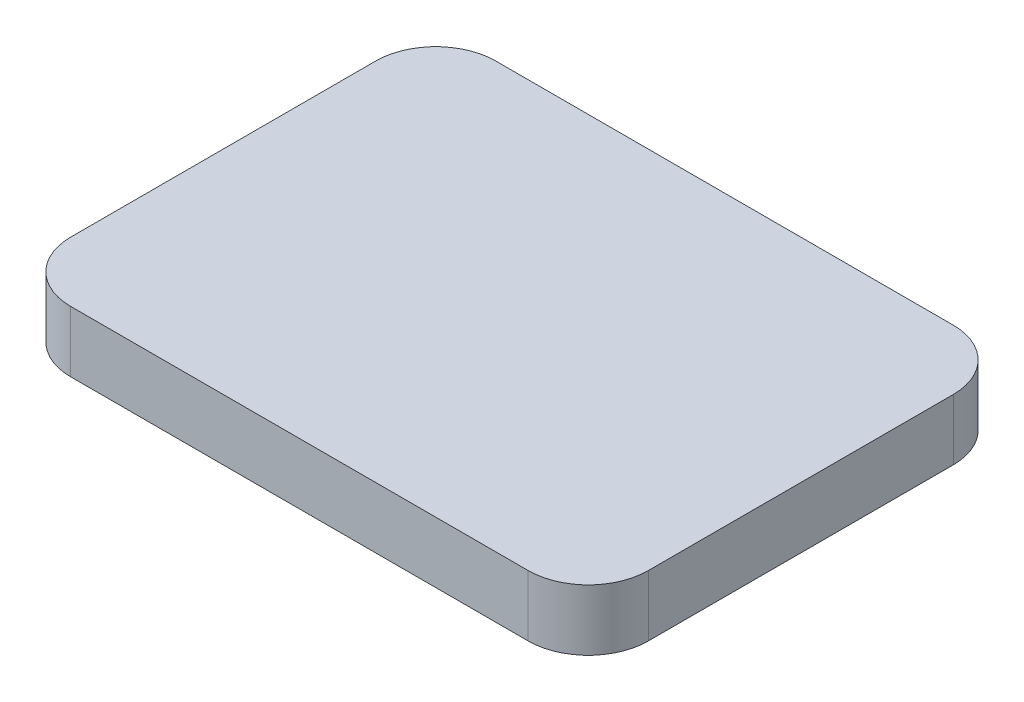
ISO-10303-21;
HEADER;
FILE_DESCRIPTION(('STEP AP214'),'2;1');
FILE_NAME('part.step','',(''),(''),'','','');
FILE_SCHEMA(('AUTOMOTIVE_DESIGN { 1 0 10303 214 1 1 1 1 }'));
ENDSEC;
DATA;
#1=APPLICATION_CONTEXT('core data for automotive mechanical design processes');
#2=APPLICATION_PROTOCOL_DEFINITION('international standard','automotive_design',2000,#1);
#3=PRODUCT_CONTEXT('',#1,'mechanical');
#4=PRODUCT('Part','Part','',(#3));
#5=PRODUCT_RELATED_PRODUCT_CATEGORY('part','',(#4));
#6=PRODUCT_DEFINITION_FORMATION('','',#4);
#7=PRODUCT_DEFINITION_CONTEXT('part definition',#1,'design');
#8=PRODUCT_DEFINITION('design','',#6,#7);
#9=PRODUCT_DEFINITION_SHAPE('','',#8);
#10=(LENGTH_UNIT() NAMED_UNIT(*) SI_UNIT(.MILLI.,.METRE.));
#11=(NAMED_UNIT(*) PLANE_ANGLE_UNIT() SI_UNIT($,.RADIAN.));
#12=(NAMED_UNIT(*) SI_UNIT($,.STERADIAN.) SOLID_ANGLE_UNIT());
#13=UNCERTAINTY_MEASURE_WITH_UNIT(LENGTH_MEASURE(1.E-05),#10,'distance_accuracy_value','');
#14=(GEOMETRIC_REPRESENTATION_CONTEXT(3) GLOBAL_UNCERTAINTY_ASSIGNED_CONTEXT((#13)) GLOBAL_UNIT_ASSIGNED_CONTEXT((#10,
#11,#12)) REPRESENTATION_CONTEXT('',''));
#15=CARTESIAN_POINT('',(0.,0.,0.));
#16=DIRECTION('',(0.,0.,1.));
#17=DIRECTION('',(1.,0.,0.));
#18=AXIS2_PLACEMENT_3D('',#15,#16,#17);
#19=CARTESIAN_POINT('',(-38.1,10.16,-25.4));
#20=DIRECTION('',(0.,-1.,0.));
#21=DIRECTION('',(0.,0.,-1.));
#22=AXIS2_PLACEMENT_3D('',#19,#20,#21);
#23=CYLINDRICAL_SURFACE('',#22,10.);
#24=CARTESIAN_POINT('',(-38.1,0.,-25.4));
#25=DIRECTION('',(0.,1.,0.));
#26=DIRECTION('',(0.,0.,-1.));
#27=AXIS2_PLACEMENT_3D('',#24,#25,#26);
#28=CIRCLE('',#27,10.);
#29=CARTESIAN_POINT('',(-38.1,0.,-35.4));
#30=VERTEX_POINT('',#29);
#31=CARTESIAN_POINT('',(-48.1,0.,-25.4));
#32=VERTEX_POINT('',#31);
#33=EDGE_CURVE('E135',#30,#32,#28,.T.);
#34=ORIENTED_EDGE('',*,*,#33,.T.);
#35=DIRECTION('',(0.,-1.,0.));
#36=VECTOR('',#35,1.);
#37=CARTESIAN_POINT('',(-48.1,10.16,-25.4));
#38=LINE('',#37,#36);
#39=CARTESIAN_POINT('',(-48.1,10.16,-25.4));
#40=VERTEX_POINT('',#39);
#41=EDGE_CURVE('E11',#40,#32,#38,.T.);
#42=ORIENTED_EDGE('',*,*,#41,.F.);
#43=CARTESIAN_POINT('',(-38.1,10.16,-25.4));
#44=DIRECTION('',(0.,1.,0.));
#45=DIRECTION('',(0.,0.,-1.));
#46=AXIS2_PLACEMENT_3D('',#43,#44,#45);
#47=CIRCLE('',#46,10.);
#48=CARTESIAN_POINT('',(-38.1,10.16,-35.4));
#49=VERTEX_POINT('',#48);
#50=EDGE_CURVE('E149',#49,#40,#47,.T.);
#51=ORIENTED_EDGE('',*,*,#50,.F.);
#52=DIRECTION('',(0.,-1.,0.));
#53=VECTOR('',#52,1.);
#54=CARTESIAN_POINT('',(-38.1,10.16,-35.4));
#55=LINE('',#54,#53);
#56=EDGE_CURVE('E131',#49,#30,#55,.T.);
#57=ORIENTED_EDGE('',*,*,#56,.T.);
#58=EDGE_LOOP('',(#34,#42,#51,#57));
#59=FACE_BOUND('',#58,.T.);
#60=ADVANCED_FACE('F39',(#59),#23,.T.);
#61=CARTESIAN_POINT('',(-48.1,10.16,25.4));
#62=DIRECTION('',(1.,0.,0.));
#63=DIRECTION('',(0.,0.,-1.));
#64=AXIS2_PLACEMENT_3D('',#61,#62,#63);
#65=PLANE('',#64);
#66=DIRECTION('',(0.,0.,1.));
#67=VECTOR('',#66,1.);
#68=CARTESIAN_POINT('',(-48.1,0.,25.4));
#69=LINE('',#68,#67);
#70=CARTESIAN_POINT('',(-48.1,0.,25.4));
#71=VERTEX_POINT('',#70);
#72=EDGE_CURVE('E138',#32,#71,#69,.T.);
#73=ORIENTED_EDGE('',*,*,#72,.T.);
#74=DIRECTION('',(0.,-1.,0.));
#75=VECTOR('',#74,1.);
#76=CARTESIAN_POINT('',(-48.1,10.16,25.4));
#77=LINE('',#76,#75);
#78=CARTESIAN_POINT('',(-48.1,10.16,25.4));
#79=VERTEX_POINT('',#78);
#80=EDGE_CURVE('E47',#79,#71,#77,.T.);
#81=ORIENTED_EDGE('',*,*,#80,.F.);
#82=DIRECTION('',(0.,0.,1.));
#83=VECTOR('',#82,1.);
#84=CARTESIAN_POINT('',(-48.1,10.16,25.4));
#85=LINE('',#84,#83);
#86=EDGE_CURVE('E98',#40,#79,#85,.T.);
#87=ORIENTED_EDGE('',*,*,#86,.F.);
#88=ORIENTED_EDGE('',*,*,#41,.T.);
#89=EDGE_LOOP('',(#73,#81,#87,#88));
#90=FACE_BOUND('',#89,.T.);
#91=ADVANCED_FACE('F184',(#90),#65,.F.);
#92=CARTESIAN_POINT('',(-38.1,10.16,25.4));
#93=DIRECTION('',(0.,-1.,0.));
#94=DIRECTION('',(0.,0.,-1.));
#95=AXIS2_PLACEMENT_3D('',#92,#93,#94);
#96=CYLINDRICAL_SURFACE('',#95,10.);
#97=CARTESIAN_POINT('',(-38.1,0.,25.4));
#98=DIRECTION('',(0.,1.,0.));
#99=DIRECTION('',(0.,0.,-1.));
#100=AXIS2_PLACEMENT_3D('',#97,#98,#99);
#101=CIRCLE('',#100,10.);
#102=CARTESIAN_POINT('',(-38.1,0.,35.4));
#103=VERTEX_POINT('',#102);
#104=EDGE_CURVE('E140',#71,#103,#101,.T.);
#105=ORIENTED_EDGE('',*,*,#104,.T.);
#106=DIRECTION('',(0.,-1.,0.));
#107=VECTOR('',#106,1.);
#108=CARTESIAN_POINT('',(-38.1,10.16,35.4));
#109=LINE('',#108,#107);
#110=CARTESIAN_POINT('',(-38.1,10.16,35.4));
#111=VERTEX_POINT('',#110);
#112=EDGE_CURVE('E156',#111,#103,#109,.T.);
#113=ORIENTED_EDGE('',*,*,#112,.F.);
#114=CARTESIAN_POINT('',(-38.1,10.16,25.4));
#115=DIRECTION('',(0.,1.,0.));
#116=DIRECTION('',(0.,0.,-1.));
#117=AXIS2_PLACEMENT_3D('',#114,#115,#116);
#118=CIRCLE('',#117,10.);
#119=EDGE_CURVE('E164',#79,#111,#118,.T.);
#120=ORIENTED_EDGE('',*,*,#119,.F.);
#121=ORIENTED_EDGE('',*,*,#80,.T.);
#122=EDGE_LOOP('',(#105,#113,#120,#121));
#123=FACE_BOUND('',#122,.T.);
#124=ADVANCED_FACE('F162',(#123),#96,.T.);
#125=CARTESIAN_POINT('',(-38.1,10.16,35.4));
#126=DIRECTION('',(0.,0.,-1.));
#127=DIRECTION('',(-1.,0.,0.));
#128=AXIS2_PLACEMENT_3D('',#125,#126,#127);
#129=PLANE('',#128);
#130=DIRECTION('',(1.,0.,0.));
#131=VECTOR('',#130,1.);
#132=CARTESIAN_POINT('',(-38.1,0.,35.4));
#133=LINE('',#132,#131);
#134=CARTESIAN_POINT('',(38.1,0.,35.4));
#135=VERTEX_POINT('',#134);
#136=EDGE_CURVE('E142',#103,#135,#133,.T.);
#137=ORIENTED_EDGE('',*,*,#136,.T.);
#138=DIRECTION('',(0.,-1.,0.));
#139=VECTOR('',#138,1.);
#140=CARTESIAN_POINT('',(38.1,10.16,35.4));
#141=LINE('',#140,#139);
#142=CARTESIAN_POINT('',(38.1,10.16,35.4));
#143=VERTEX_POINT('',#142);
#144=EDGE_CURVE('E153',#143,#135,#141,.T.);
#145=ORIENTED_EDGE('',*,*,#144,.F.);
#146=DIRECTION('',(1.,0.,0.));
#147=VECTOR('',#146,1.);
#148=CARTESIAN_POINT('',(-38.1,10.16,35.4));
#149=LINE('',#148,#147);
#150=EDGE_CURVE('E176',#111,#143,#149,.T.);
#151=ORIENTED_EDGE('',*,*,#150,.F.);
#152=ORIENTED_EDGE('',*,*,#112,.T.);
#153=EDGE_LOOP('',(#137,#145,#151,#152));
#154=FACE_BOUND('',#153,.T.);
#155=ADVANCED_FACE('F172',(#154),#129,.F.);
#156=CARTESIAN_POINT('',(38.1,10.16,25.4));
#157=DIRECTION('',(0.,-1.,0.));
#158=DIRECTION('',(0.,0.,-1.));
#159=AXIS2_PLACEMENT_3D('',#156,#157,#158);
#160=CYLINDRICAL_SURFACE('',#159,10.);
#161=CARTESIAN_POINT('',(38.1,0.,25.4));
#162=DIRECTION('',(0.,1.,0.));
#163=DIRECTION('',(0.,0.,1.));
#164=AXIS2_PLACEMENT_3D('',#161,#162,#163);
#165=CIRCLE('',#164,10.);
#166=CARTESIAN_POINT('',(48.1,0.,25.4));
#167=VERTEX_POINT('',#166);
#168=EDGE_CURVE('E144',#135,#167,#165,.T.);
#169=ORIENTED_EDGE('',*,*,#168,.T.);
#170=DIRECTION('',(0.,-1.,0.));
#171=VECTOR('',#170,1.);
#172=CARTESIAN_POINT('',(48.1,10.16,25.4));
#173=LINE('',#172,#171);
#174=CARTESIAN_POINT('',(48.1,10.16,25.4));
#175=VERTEX_POINT('',#174);
#176=EDGE_CURVE('E126',#175,#167,#173,.T.);
#177=ORIENTED_EDGE('',*,*,#176,.F.);
#178=CARTESIAN_POINT('',(38.1,10.16,25.4));
#179=DIRECTION('',(0.,1.,0.));
#180=DIRECTION('',(0.,0.,1.));
#181=AXIS2_PLACEMENT_3D('',#178,#179,#180);
#182=CIRCLE('',#181,10.);
#183=EDGE_CURVE('E117',#143,#175,#182,.T.);
#184=ORIENTED_EDGE('',*,*,#183,.F.);
#185=ORIENTED_EDGE('',*,*,#144,.T.);
#186=EDGE_LOOP('',(#169,#177,#184,#185));
#187=FACE_BOUND('',#186,.T.);
#188=ADVANCED_FACE('F175',(#187),#160,.T.);
#189=CARTESIAN_POINT('',(48.1,10.16,25.4));
#190=DIRECTION('',(-1.,0.,0.));
#191=DIRECTION('',(0.,0.,1.));
#192=AXIS2_PLACEMENT_3D('',#189,#190,#191);
#193=PLANE('',#192);
#194=DIRECTION('',(0.,0.,-1.));
#195=VECTOR('',#194,1.);
#196=CARTESIAN_POINT('',(48.1,0.,25.4));
#197=LINE('',#196,#195);
#198=CARTESIAN_POINT('',(48.1,0.,-25.4));
#199=VERTEX_POINT('',#198);
#200=EDGE_CURVE('E125',#167,#199,#197,.T.);
#201=ORIENTED_EDGE('',*,*,#200,.T.);
#202=DIRECTION('',(0.,-1.,0.));
#203=VECTOR('',#202,1.);
#204=CARTESIAN_POINT('',(48.1,10.16,-25.4));
#205=LINE('',#204,#203);
#206=CARTESIAN_POINT('',(48.1,10.16,-25.4));
#207=VERTEX_POINT('',#206);
#208=EDGE_CURVE('E122',#207,#199,#205,.T.);
#209=ORIENTED_EDGE('',*,*,#208,.F.);
#210=DIRECTION('',(0.,0.,-1.));
#211=VECTOR('',#210,1.);
#212=CARTESIAN_POINT('',(48.1,10.16,25.4));
#213=LINE('',#212,#211);
#214=EDGE_CURVE('E111',#175,#207,#213,.T.);
#215=ORIENTED_EDGE('',*,*,#214,.F.);
#216=ORIENTED_EDGE('',*,*,#176,.T.);
#217=EDGE_LOOP('',(#201,#209,#215,#216));
#218=FACE_BOUND('',#217,.T.);
#219=ADVANCED_FACE('F123',(#218),#193,.F.);
#220=CARTESIAN_POINT('',(38.1,10.16,-25.4));
#221=DIRECTION('',(0.,-1.,0.));
#222=DIRECTION('',(0.,0.,-1.));
#223=AXIS2_PLACEMENT_3D('',#220,#221,#222);
#224=CYLINDRICAL_SURFACE('',#223,10.);
#225=CARTESIAN_POINT('',(38.1,0.,-25.4));
#226=DIRECTION('',(0.,1.,0.));
#227=DIRECTION('',(0.,0.,-1.));
#228=AXIS2_PLACEMENT_3D('',#225,#226,#227);
#229=CIRCLE('',#228,10.);
#230=CARTESIAN_POINT('',(38.1,0.,-35.4));
#231=VERTEX_POINT('',#230);
#232=EDGE_CURVE('E84',#199,#231,#229,.T.);
#233=ORIENTED_EDGE('',*,*,#232,.T.);
#234=DIRECTION('',(0.,-1.,0.));
#235=VECTOR('',#234,1.);
#236=CARTESIAN_POINT('',(38.1,10.16,-35.4));
#237=LINE('',#236,#235);
#238=CARTESIAN_POINT('',(38.1,10.16,-35.4));
#239=VERTEX_POINT('',#238);
#240=EDGE_CURVE('E127',#239,#231,#237,.T.);
#241=ORIENTED_EDGE('',*,*,#240,.F.);
#242=CARTESIAN_POINT('',(38.1,10.16,-25.4));
#243=DIRECTION('',(0.,1.,0.));
#244=DIRECTION('',(0.,0.,-1.));
#245=AXIS2_PLACEMENT_3D('',#242,#243,#244);
#246=CIRCLE('',#245,10.);
#247=EDGE_CURVE('E115',#207,#239,#246,.T.);
#248=ORIENTED_EDGE('',*,*,#247,.F.);
#249=ORIENTED_EDGE('',*,*,#208,.T.);
#250=EDGE_LOOP('',(#233,#241,#248,#249));
#251=FACE_BOUND('',#250,.T.);
#252=ADVANCED_FACE('F129',(#251),#224,.T.);
#253=CARTESIAN_POINT('',(-38.1,10.16,-35.4));
#254=DIRECTION('',(0.,0.,1.));
#255=DIRECTION('',(1.,0.,0.));
#256=AXIS2_PLACEMENT_3D('',#253,#254,#255);
#257=PLANE('',#256);
#258=DIRECTION('',(-1.,0.,0.));
#259=VECTOR('',#258,1.);
#260=CARTESIAN_POINT('',(-38.1,0.,-35.4));
#261=LINE('',#260,#259);
#262=EDGE_CURVE('E90',#231,#30,#261,.T.);
#263=ORIENTED_EDGE('',*,*,#262,.T.);
#264=ORIENTED_EDGE('',*,*,#56,.F.);
#265=DIRECTION('',(-1.,0.,0.));
#266=VECTOR('',#265,1.);
#267=CARTESIAN_POINT('',(-38.1,10.16,-35.4));
#268=LINE('',#267,#266);
#269=EDGE_CURVE('E55',#239,#49,#268,.T.);
#270=ORIENTED_EDGE('',*,*,#269,.F.);
#271=ORIENTED_EDGE('',*,*,#240,.T.);
#272=EDGE_LOOP('',(#263,#264,#270,#271));
#273=FACE_BOUND('',#272,.T.);
#274=ADVANCED_FACE('F200',(#273),#257,.F.);
#275=CARTESIAN_POINT('',(-38.1,10.16,-25.4));
#276=DIRECTION('',(0.,-1.,0.));
#277=DIRECTION('',(0.,0.,-1.));
#278=AXIS2_PLACEMENT_3D('',#275,#276,#277);
#279=PLANE('',#278);
#280=ORIENTED_EDGE('',*,*,#50,.T.);
#281=ORIENTED_EDGE('',*,*,#86,.T.);
#282=ORIENTED_EDGE('',*,*,#119,.T.);
#283=ORIENTED_EDGE('',*,*,#150,.T.);
#284=ORIENTED_EDGE('',*,*,#183,.T.);
#285=ORIENTED_EDGE('',*,*,#214,.T.);
#286=ORIENTED_EDGE('',*,*,#247,.T.);
#287=ORIENTED_EDGE('',*,*,#269,.T.);
#288=EDGE_LOOP('',(#280,#281,#282,#283,#284,#285,#286,#287));
#289=FACE_BOUND('',#288,.T.);
#290=ADVANCED_FACE('F113',(#289),#279,.F.);
#291=CARTESIAN_POINT('',(-38.1,0.,-25.4));
#292=DIRECTION('',(0.,-1.,0.));
#293=DIRECTION('',(0.,0.,-1.));
#294=AXIS2_PLACEMENT_3D('',#291,#292,#293);
#295=PLANE('',#294);
#296=ORIENTED_EDGE('',*,*,#33,.F.);
#297=ORIENTED_EDGE('',*,*,#262,.F.);
#298=ORIENTED_EDGE('',*,*,#232,.F.);
#299=ORIENTED_EDGE('',*,*,#200,.F.);
#300=ORIENTED_EDGE('',*,*,#168,.F.);
#301=ORIENTED_EDGE('',*,*,#136,.F.);
#302=ORIENTED_EDGE('',*,*,#104,.F.);
#303=ORIENTED_EDGE('',*,*,#72,.F.);
#304=EDGE_LOOP('',(#296,#297,#298,#299,#300,#301,#302,#303));
#305=FACE_BOUND('',#304,.T.);
#306=ADVANCED_FACE('F168',(#305),#295,.T.);
#307=CLOSED_SHELL('',(#60,#91,#124,#155,#188,#219,#252,#274,#290,#306));
#308=MANIFOLD_SOLID_BREP('B2',#307);
#309=ADVANCED_BREP_SHAPE_REPRESENTATION('',(#18,#308),#14);
#310=SHAPE_DEFINITION_REPRESENTATION(#9,#309);
ENDSEC;
END-ISO-10303-21;
